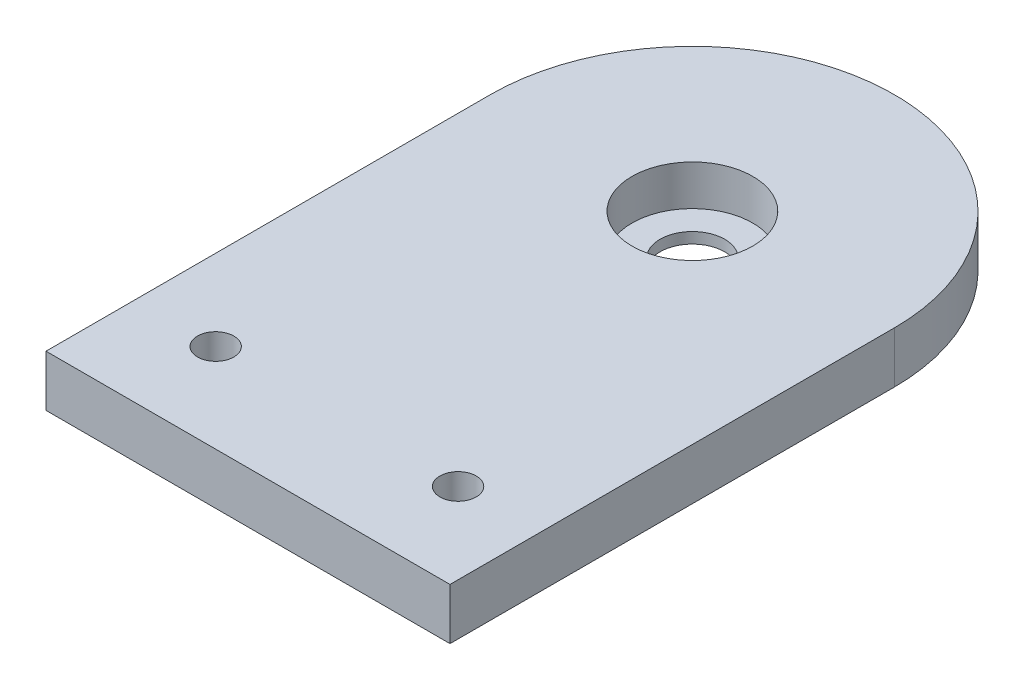
ISO-10303-21;
HEADER;
FILE_DESCRIPTION(('STEP AP214'),'2;1');
FILE_NAME('part.step','',(''),(''),'','','');
FILE_SCHEMA(('AUTOMOTIVE_DESIGN { 1 0 10303 214 1 1 1 1 }'));
ENDSEC;
DATA;
#1=APPLICATION_CONTEXT('core data for automotive mechanical design processes');
#2=APPLICATION_PROTOCOL_DEFINITION('international standard','automotive_design',2000,#1);
#3=PRODUCT_CONTEXT('',#1,'mechanical');
#4=PRODUCT('Part','Part','',(#3));
#5=PRODUCT_RELATED_PRODUCT_CATEGORY('part','',(#4));
#6=PRODUCT_DEFINITION_FORMATION('','',#4);
#7=PRODUCT_DEFINITION_CONTEXT('part definition',#1,'design');
#8=PRODUCT_DEFINITION('design','',#6,#7);
#9=PRODUCT_DEFINITION_SHAPE('','',#8);
#10=(LENGTH_UNIT() NAMED_UNIT(*) SI_UNIT(.MILLI.,.METRE.));
#11=(NAMED_UNIT(*) PLANE_ANGLE_UNIT() SI_UNIT($,.RADIAN.));
#12=(NAMED_UNIT(*) SI_UNIT($,.STERADIAN.) SOLID_ANGLE_UNIT());
#13=UNCERTAINTY_MEASURE_WITH_UNIT(LENGTH_MEASURE(1.E-05),#10,'distance_accuracy_value','');
#14=(GEOMETRIC_REPRESENTATION_CONTEXT(3) GLOBAL_UNCERTAINTY_ASSIGNED_CONTEXT((#13)) GLOBAL_UNIT_ASSIGNED_CONTEXT((#10,
#11,#12)) REPRESENTATION_CONTEXT('',''));
#15=CARTESIAN_POINT('',(0.,0.,0.));
#16=DIRECTION('',(0.,0.,1.));
#17=DIRECTION('',(1.,0.,0.));
#18=AXIS2_PLACEMENT_3D('',#15,#16,#17);
#19=CARTESIAN_POINT('',(25.,-34.5,526.));
#20=DIRECTION('',(-1.,0.,0.));
#21=DIRECTION('',(0.,0.,1.));
#22=AXIS2_PLACEMENT_3D('',#19,#20,#21);
#23=PLANE('',#22);
#24=DIRECTION('',(0.,0.,-1.));
#25=VECTOR('',#24,1.);
#26=CARTESIAN_POINT('',(25.,-40.85,526.));
#27=LINE('',#26,#25);
#28=CARTESIAN_POINT('',(25.,-40.85,545.));
#29=VERTEX_POINT('',#28);
#30=CARTESIAN_POINT('',(25.,-40.85,490.));
#31=VERTEX_POINT('',#30);
#32=EDGE_CURVE('E122',#29,#31,#27,.T.);
#33=ORIENTED_EDGE('',*,*,#32,.T.);
#34=DIRECTION('',(0.,-1.,0.));
#35=VECTOR('',#34,1.);
#36=CARTESIAN_POINT('',(25.,-34.5,490.));
#37=LINE('',#36,#35);
#38=CARTESIAN_POINT('',(25.,-34.5,490.));
#39=VERTEX_POINT('',#38);
#40=EDGE_CURVE('E11',#39,#31,#37,.T.);
#41=ORIENTED_EDGE('',*,*,#40,.F.);
#42=DIRECTION('',(0.,0.,-1.));
#43=VECTOR('',#42,1.);
#44=CARTESIAN_POINT('',(25.,-34.5,526.));
#45=LINE('',#44,#43);
#46=CARTESIAN_POINT('',(25.,-34.5,545.));
#47=VERTEX_POINT('',#46);
#48=EDGE_CURVE('E81',#47,#39,#45,.T.);
#49=ORIENTED_EDGE('',*,*,#48,.F.);
#50=DIRECTION('',(0.,-1.,0.));
#51=VECTOR('',#50,1.);
#52=CARTESIAN_POINT('',(25.,-34.5,545.));
#53=LINE('',#52,#51);
#54=EDGE_CURVE('E98',#47,#29,#53,.T.);
#55=ORIENTED_EDGE('',*,*,#54,.T.);
#56=EDGE_LOOP('',(#33,#41,#49,#55));
#57=FACE_BOUND('',#56,.T.);
#58=ADVANCED_FACE('F39',(#57),#23,.F.);
#59=CARTESIAN_POINT('',(-25.,-34.5,526.));
#60=DIRECTION('',(1.,0.,0.));
#61=DIRECTION('',(0.,0.,-1.));
#62=AXIS2_PLACEMENT_3D('',#59,#60,#61);
#63=PLANE('',#62);
#64=DIRECTION('',(0.,0.,1.));
#65=VECTOR('',#64,1.);
#66=CARTESIAN_POINT('',(-25.,-40.85,526.));
#67=LINE('',#66,#65);
#68=CARTESIAN_POINT('',(-25.,-40.85,490.));
#69=VERTEX_POINT('',#68);
#70=CARTESIAN_POINT('',(-25.,-40.85,545.));
#71=VERTEX_POINT('',#70);
#72=EDGE_CURVE('E92',#69,#71,#67,.T.);
#73=ORIENTED_EDGE('',*,*,#72,.T.);
#74=DIRECTION('',(0.,-1.,0.));
#75=VECTOR('',#74,1.);
#76=CARTESIAN_POINT('',(-25.,-34.5,545.));
#77=LINE('',#76,#75);
#78=CARTESIAN_POINT('',(-25.,-34.5,545.));
#79=VERTEX_POINT('',#78);
#80=EDGE_CURVE('E87',#79,#71,#77,.T.);
#81=ORIENTED_EDGE('',*,*,#80,.F.);
#82=DIRECTION('',(0.,0.,1.));
#83=VECTOR('',#82,1.);
#84=CARTESIAN_POINT('',(-25.,-34.5,526.));
#85=LINE('',#84,#83);
#86=CARTESIAN_POINT('',(-25.,-34.5,490.));
#87=VERTEX_POINT('',#86);
#88=EDGE_CURVE('E77',#87,#79,#85,.T.);
#89=ORIENTED_EDGE('',*,*,#88,.F.);
#90=DIRECTION('',(0.,-1.,0.));
#91=VECTOR('',#90,1.);
#92=CARTESIAN_POINT('',(-25.,-34.5,490.));
#93=LINE('',#92,#91);
#94=EDGE_CURVE('E46',#87,#69,#93,.T.);
#95=ORIENTED_EDGE('',*,*,#94,.T.);
#96=EDGE_LOOP('',(#73,#81,#89,#95));
#97=FACE_BOUND('',#96,.T.);
#98=ADVANCED_FACE('F90',(#97),#63,.F.);
#99=CARTESIAN_POINT('',(0.,-34.5,0.));
#100=DIRECTION('',(0.,-1.,0.));
#101=DIRECTION('',(0.,0.,-1.));
#102=AXIS2_PLACEMENT_3D('',#99,#100,#101);
#103=PLANE('',#102);
#104=CARTESIAN_POINT('',(-15.,-34.5,534.));
#105=DIRECTION('',(0.,1.,0.));
#106=DIRECTION('',(0.,0.,1.));
#107=AXIS2_PLACEMENT_3D('',#104,#105,#106);
#108=CIRCLE('',#107,2.25);
#109=CARTESIAN_POINT('',(-15.,-34.5,536.25));
#110=VERTEX_POINT('',#109);
#111=EDGE_CURVE('E101',#110,#110,#108,.T.);
#112=ORIENTED_EDGE('',*,*,#111,.F.);
#113=EDGE_LOOP('',(#112));
#114=FACE_BOUND('',#113,.T.);
#115=CARTESIAN_POINT('',(15.,-34.5,534.));
#116=DIRECTION('',(0.,1.,0.));
#117=DIRECTION('',(0.,0.,1.));
#118=AXIS2_PLACEMENT_3D('',#115,#116,#117);
#119=CIRCLE('',#118,2.25);
#120=CARTESIAN_POINT('',(15.,-34.5,536.25));
#121=VERTEX_POINT('',#120);
#122=EDGE_CURVE('E106',#121,#121,#119,.T.);
#123=ORIENTED_EDGE('',*,*,#122,.F.);
#124=EDGE_LOOP('',(#123));
#125=FACE_BOUND('',#124,.T.);
#126=CARTESIAN_POINT('',(0.,-34.5,490.));
#127=DIRECTION('',(0.,1.,0.));
#128=DIRECTION('',(0.,0.,1.));
#129=AXIS2_PLACEMENT_3D('',#126,#127,#128);
#130=CIRCLE('',#129,7.475);
#131=CARTESIAN_POINT('',(0.,-34.5,497.475));
#132=VERTEX_POINT('',#131);
#133=EDGE_CURVE('E114',#132,#132,#130,.T.);
#134=ORIENTED_EDGE('',*,*,#133,.F.);
#135=EDGE_LOOP('',(#134));
#136=FACE_BOUND('',#135,.T.);
#137=ORIENTED_EDGE('',*,*,#48,.T.);
#138=CARTESIAN_POINT('',(0.,-34.5,490.));
#139=DIRECTION('',(0.,1.,0.));
#140=DIRECTION('',(0.,0.,1.));
#141=AXIS2_PLACEMENT_3D('',#138,#139,#140);
#142=CIRCLE('',#141,25.);
#143=EDGE_CURVE('E82',#39,#87,#142,.T.);
#144=ORIENTED_EDGE('',*,*,#143,.T.);
#145=ORIENTED_EDGE('',*,*,#88,.T.);
#146=DIRECTION('',(1.,0.,0.));
#147=VECTOR('',#146,1.);
#148=CARTESIAN_POINT('',(-25.,-34.5,545.));
#149=LINE('',#148,#147);
#150=EDGE_CURVE('E83',#79,#47,#149,.T.);
#151=ORIENTED_EDGE('',*,*,#150,.T.);
#152=EDGE_LOOP('',(#137,#144,#145,#151));
#153=FACE_BOUND('',#152,.T.);
#154=ADVANCED_FACE('F79',(#114,#125,#136,#153),#103,.F.);
#155=CARTESIAN_POINT('',(0.,-40.85,0.));
#156=DIRECTION('',(0.,-1.,0.));
#157=DIRECTION('',(0.,0.,-1.));
#158=AXIS2_PLACEMENT_3D('',#155,#156,#157);
#159=PLANE('',#158);
#160=CARTESIAN_POINT('',(-15.,-40.85,534.));
#161=DIRECTION('',(0.,1.,0.));
#162=DIRECTION('',(0.,0.,1.));
#163=AXIS2_PLACEMENT_3D('',#160,#161,#162);
#164=CIRCLE('',#163,2.25);
#165=CARTESIAN_POINT('',(-15.,-40.85,536.25));
#166=VERTEX_POINT('',#165);
#167=EDGE_CURVE('E173',#166,#166,#164,.T.);
#168=ORIENTED_EDGE('',*,*,#167,.T.);
#169=EDGE_LOOP('',(#168));
#170=FACE_BOUND('',#169,.T.);
#171=CARTESIAN_POINT('',(15.,-40.85,534.));
#172=DIRECTION('',(0.,1.,0.));
#173=DIRECTION('',(0.,0.,1.));
#174=AXIS2_PLACEMENT_3D('',#171,#172,#173);
#175=CIRCLE('',#174,2.25);
#176=CARTESIAN_POINT('',(15.,-40.85,536.25));
#177=VERTEX_POINT('',#176);
#178=EDGE_CURVE('E172',#177,#177,#175,.T.);
#179=ORIENTED_EDGE('',*,*,#178,.T.);
#180=EDGE_LOOP('',(#179));
#181=FACE_BOUND('',#180,.T.);
#182=CARTESIAN_POINT('',(0.,-40.85,490.));
#183=DIRECTION('',(0.,1.,0.));
#184=DIRECTION('',(0.,0.,1.));
#185=AXIS2_PLACEMENT_3D('',#182,#183,#184);
#186=CIRCLE('',#185,4.);
#187=CARTESIAN_POINT('',(0.,-40.85,486.));
#188=VERTEX_POINT('',#187);
#189=EDGE_CURVE('E91',#188,#188,#186,.T.);
#190=ORIENTED_EDGE('',*,*,#189,.T.);
#191=EDGE_LOOP('',(#190));
#192=FACE_BOUND('',#191,.T.);
#193=ORIENTED_EDGE('',*,*,#72,.F.);
#194=CARTESIAN_POINT('',(0.,-40.85,490.));
#195=DIRECTION('',(0.,1.,0.));
#196=DIRECTION('',(0.,0.,1.));
#197=AXIS2_PLACEMENT_3D('',#194,#195,#196);
#198=CIRCLE('',#197,25.);
#199=EDGE_CURVE('E55',#31,#69,#198,.T.);
#200=ORIENTED_EDGE('',*,*,#199,.F.);
#201=ORIENTED_EDGE('',*,*,#32,.F.);
#202=DIRECTION('',(1.,0.,0.));
#203=VECTOR('',#202,1.);
#204=CARTESIAN_POINT('',(-25.,-40.85,545.));
#205=LINE('',#204,#203);
#206=EDGE_CURVE('E99',#71,#29,#205,.T.);
#207=ORIENTED_EDGE('',*,*,#206,.F.);
#208=EDGE_LOOP('',(#193,#200,#201,#207));
#209=FACE_BOUND('',#208,.T.);
#210=ADVANCED_FACE('F129',(#170,#181,#192,#209),#159,.T.);
#211=CARTESIAN_POINT('',(0.,-34.5,490.));
#212=DIRECTION('',(0.,-1.,0.));
#213=DIRECTION('',(0.,0.,-1.));
#214=AXIS2_PLACEMENT_3D('',#211,#212,#213);
#215=CYLINDRICAL_SURFACE('',#214,25.);
#216=ORIENTED_EDGE('',*,*,#143,.F.);
#217=ORIENTED_EDGE('',*,*,#40,.T.);
#218=ORIENTED_EDGE('',*,*,#199,.T.);
#219=ORIENTED_EDGE('',*,*,#94,.F.);
#220=EDGE_LOOP('',(#216,#217,#218,#219));
#221=FACE_BOUND('',#220,.T.);
#222=ADVANCED_FACE('F145',(#221),#215,.T.);
#223=CARTESIAN_POINT('',(0.,-34.5,490.));
#224=DIRECTION('',(0.,-1.,0.));
#225=DIRECTION('',(0.,0.,-1.));
#226=AXIS2_PLACEMENT_3D('',#223,#224,#225);
#227=CYLINDRICAL_SURFACE('',#226,7.475);
#228=ORIENTED_EDGE('',*,*,#133,.T.);
#229=EDGE_LOOP('',(#228));
#230=FACE_BOUND('',#229,.T.);
#231=CARTESIAN_POINT('',(0.,-39.5,490.));
#232=DIRECTION('',(0.,1.,0.));
#233=DIRECTION('',(0.,0.,1.));
#234=AXIS2_PLACEMENT_3D('',#231,#232,#233);
#235=CIRCLE('',#234,7.475);
#236=CARTESIAN_POINT('',(0.,-39.5,497.475));
#237=VERTEX_POINT('',#236);
#238=EDGE_CURVE('E115',#237,#237,#235,.T.);
#239=ORIENTED_EDGE('',*,*,#238,.F.);
#240=EDGE_LOOP('',(#239));
#241=FACE_BOUND('',#240,.T.);
#242=ADVANCED_FACE('F149',(#230,#241),#227,.F.);
#243=CARTESIAN_POINT('',(0.,-39.5,490.));
#244=DIRECTION('',(0.,1.,0.));
#245=DIRECTION('',(0.,0.,1.));
#246=AXIS2_PLACEMENT_3D('',#243,#244,#245);
#247=PLANE('',#246);
#248=CARTESIAN_POINT('',(0.,-39.5,490.));
#249=DIRECTION('',(0.,1.,0.));
#250=DIRECTION('',(0.,0.,1.));
#251=AXIS2_PLACEMENT_3D('',#248,#249,#250);
#252=CIRCLE('',#251,4.);
#253=CARTESIAN_POINT('',(0.,-39.5,486.));
#254=VERTEX_POINT('',#253);
#255=EDGE_CURVE('E107',#254,#254,#252,.T.);
#256=ORIENTED_EDGE('',*,*,#255,.F.);
#257=EDGE_LOOP('',(#256));
#258=FACE_BOUND('',#257,.T.);
#259=ORIENTED_EDGE('',*,*,#238,.T.);
#260=EDGE_LOOP('',(#259));
#261=FACE_BOUND('',#260,.T.);
#262=ADVANCED_FACE('F146',(#258,#261),#247,.T.);
#263=CARTESIAN_POINT('',(0.,-39.5,490.));
#264=DIRECTION('',(0.,-1.,0.));
#265=DIRECTION('',(0.,0.,-1.));
#266=AXIS2_PLACEMENT_3D('',#263,#264,#265);
#267=CYLINDRICAL_SURFACE('',#266,4.);
#268=CARTESIAN_POINT('',(0.,-39.5,486.));
#269=CARTESIAN_POINT('',(0.,-39.5140625,486.));
#270=CARTESIAN_POINT('',(0.,-39.528125,486.));
#271=CARTESIAN_POINT('',(0.,-39.55625,486.));
#272=CARTESIAN_POINT('',(0.,-39.5703125,486.));
#273=CARTESIAN_POINT('',(0.,-39.5984375,486.));
#274=CARTESIAN_POINT('',(0.,-39.6125,486.));
#275=CARTESIAN_POINT('',(0.,-39.640625,486.));
#276=CARTESIAN_POINT('',(0.,-39.6546875,486.));
#277=CARTESIAN_POINT('',(0.,-39.6828125,486.));
#278=CARTESIAN_POINT('',(0.,-39.696875,486.));
#279=CARTESIAN_POINT('',(0.,-39.725,486.));
#280=CARTESIAN_POINT('',(0.,-39.7390625,486.));
#281=CARTESIAN_POINT('',(0.,-39.7671875,486.));
#282=CARTESIAN_POINT('',(0.,-39.78125,486.));
#283=CARTESIAN_POINT('',(0.,-39.809375,486.));
#284=CARTESIAN_POINT('',(0.,-39.8234375,486.));
#285=CARTESIAN_POINT('',(0.,-39.8515625,486.));
#286=CARTESIAN_POINT('',(0.,-39.865625,486.));
#287=CARTESIAN_POINT('',(0.,-39.89375,486.));
#288=CARTESIAN_POINT('',(0.,-39.9078125,486.));
#289=CARTESIAN_POINT('',(0.,-39.9359375,486.));
#290=CARTESIAN_POINT('',(0.,-39.95,486.));
#291=CARTESIAN_POINT('',(0.,-39.978125,486.));
#292=CARTESIAN_POINT('',(0.,-39.9921875,486.));
#293=CARTESIAN_POINT('',(0.,-40.0203125,486.));
#294=CARTESIAN_POINT('',(0.,-40.034375,486.));
#295=CARTESIAN_POINT('',(0.,-40.0625,486.));
#296=CARTESIAN_POINT('',(0.,-40.0765625,486.));
#297=CARTESIAN_POINT('',(0.,-40.1046875,486.));
#298=CARTESIAN_POINT('',(0.,-40.11875,486.));
#299=CARTESIAN_POINT('',(0.,-40.146875,486.));
#300=CARTESIAN_POINT('',(0.,-40.1609375,486.));
#301=CARTESIAN_POINT('',(0.,-40.1890625,486.));
#302=CARTESIAN_POINT('',(0.,-40.203125,486.));
#303=CARTESIAN_POINT('',(0.,-40.23125,486.));
#304=CARTESIAN_POINT('',(0.,-40.2453125,486.));
#305=CARTESIAN_POINT('',(0.,-40.2734375,486.));
#306=CARTESIAN_POINT('',(0.,-40.2875,486.));
#307=CARTESIAN_POINT('',(0.,-40.315625,486.));
#308=CARTESIAN_POINT('',(0.,-40.3296875,486.));
#309=CARTESIAN_POINT('',(0.,-40.3578125,486.));
#310=CARTESIAN_POINT('',(0.,-40.371875,486.));
#311=CARTESIAN_POINT('',(0.,-40.4,486.));
#312=CARTESIAN_POINT('',(0.,-40.4140625,486.));
#313=CARTESIAN_POINT('',(0.,-40.4421875,486.));
#314=CARTESIAN_POINT('',(0.,-40.45625,486.));
#315=CARTESIAN_POINT('',(0.,-40.484375,486.));
#316=CARTESIAN_POINT('',(0.,-40.4984375,486.));
#317=CARTESIAN_POINT('',(0.,-40.5265625,486.));
#318=CARTESIAN_POINT('',(0.,-40.540625,486.));
#319=CARTESIAN_POINT('',(0.,-40.56875,486.));
#320=CARTESIAN_POINT('',(0.,-40.5828125,486.));
#321=CARTESIAN_POINT('',(0.,-40.6109375,486.));
#322=CARTESIAN_POINT('',(0.,-40.625,486.));
#323=CARTESIAN_POINT('',(0.,-40.653125,486.));
#324=CARTESIAN_POINT('',(0.,-40.6671875,486.));
#325=CARTESIAN_POINT('',(0.,-40.6953125,486.));
#326=CARTESIAN_POINT('',(0.,-40.709375,486.));
#327=CARTESIAN_POINT('',(0.,-40.7375,486.));
#328=CARTESIAN_POINT('',(0.,-40.7515625,486.));
#329=CARTESIAN_POINT('',(0.,-40.7796875,486.));
#330=CARTESIAN_POINT('',(0.,-40.79375,486.));
#331=CARTESIAN_POINT('',(0.,-40.821875,486.));
#332=CARTESIAN_POINT('',(0.,-40.8359375,486.));
#333=CARTESIAN_POINT('',(0.,-40.85,486.));
#334=B_SPLINE_CURVE_WITH_KNOTS('',3,(#268,#269,#270,#271,#272,#273,#274,#275,#276,#277,#278,
#279,#280,#281,#282,#283,#284,#285,#286,#287,#288,#289,#290,#291,#292,#293,#294,#295,#296,#297,
#298,#299,#300,#301,#302,#303,#304,#305,#306,#307,#308,#309,#310,#311,#312,#313,#314,#315,#316,
#317,#318,#319,#320,#321,#322,#323,#324,#325,#326,#327,#328,#329,#330,#331,#332,#333),
.UNSPECIFIED.,.F.,.F.,(4,2,2,2,2,2,2,2,2,2,2,2,2,2,2,2,2,2,2,2,2,2,2,2,2,2,2,2,2,2,2,2,4),(0.,
0.0421874999999988,0.0843749999999976,0.126562499999996,0.168749999999995,0.210937499999994,
0.253124999999993,0.295312499999999,0.337499999999998,0.379687499999996,0.421874999999995,
0.464062499999994,0.506249999999993,0.548437499999999,0.590624999999997,0.632812499999996,
0.674999999999995,0.717187499999994,0.759374999999993,0.801562499999992,0.843749999999997,
0.885937499999996,0.928124999999995,0.970312499999994,1.01249999999999,1.05468749999999,
1.096875,1.1390625,1.18124999999999,1.22343749999999,1.26562499999999,1.30781249999999,
1.34999999999999),.UNSPECIFIED.);
#335=EDGE_CURVE('BSEAM155',#254,#188,#334,.T.);
#336=ORIENTED_EDGE('',*,*,#255,.T.);
#337=ORIENTED_EDGE('',*,*,#189,.F.);
#338=ORIENTED_EDGE('',*,*,#335,.T.);
#339=ORIENTED_EDGE('',*,*,#335,.F.);
#340=EDGE_LOOP('',(#336,#338,#337,#339));
#341=FACE_BOUND('',#340,.T.);
#342=ADVANCED_FACE('F155',(#341),#267,.F.);
#343=CARTESIAN_POINT('',(-25.,-34.5,545.));
#344=DIRECTION('',(0.,0.,-1.));
#345=DIRECTION('',(-1.,0.,0.));
#346=AXIS2_PLACEMENT_3D('',#343,#344,#345);
#347=PLANE('',#346);
#348=ORIENTED_EDGE('',*,*,#206,.T.);
#349=ORIENTED_EDGE('',*,*,#54,.F.);
#350=ORIENTED_EDGE('',*,*,#150,.F.);
#351=ORIENTED_EDGE('',*,*,#80,.T.);
#352=EDGE_LOOP('',(#348,#349,#350,#351));
#353=FACE_BOUND('',#352,.T.);
#354=ADVANCED_FACE('F96',(#353),#347,.F.);
#355=CARTESIAN_POINT('',(15.,-34.5,534.));
#356=DIRECTION('',(0.,-1.,0.));
#357=DIRECTION('',(0.,0.,-1.));
#358=AXIS2_PLACEMENT_3D('',#355,#356,#357);
#359=CYLINDRICAL_SURFACE('',#358,2.25);
#360=ORIENTED_EDGE('',*,*,#122,.T.);
#361=EDGE_LOOP('',(#360));
#362=FACE_BOUND('',#361,.T.);
#363=ORIENTED_EDGE('',*,*,#178,.F.);
#364=EDGE_LOOP('',(#363));
#365=FACE_BOUND('',#364,.T.);
#366=ADVANCED_FACE('F159',(#362,#365),#359,.F.);
#367=CARTESIAN_POINT('',(-15.,-34.5,534.));
#368=DIRECTION('',(0.,-1.,0.));
#369=DIRECTION('',(0.,0.,-1.));
#370=AXIS2_PLACEMENT_3D('',#367,#368,#369);
#371=CYLINDRICAL_SURFACE('',#370,2.25);
#372=ORIENTED_EDGE('',*,*,#111,.T.);
#373=EDGE_LOOP('',(#372));
#374=FACE_BOUND('',#373,.T.);
#375=ORIENTED_EDGE('',*,*,#167,.F.);
#376=EDGE_LOOP('',(#375));
#377=FACE_BOUND('',#376,.T.);
#378=ADVANCED_FACE('F162',(#374,#377),#371,.F.);
#379=CLOSED_SHELL('',(#58,#98,#154,#210,#222,#242,#262,#342,#354,#366,#378));
#380=MANIFOLD_SOLID_BREP('B2',#379);
#381=ADVANCED_BREP_SHAPE_REPRESENTATION('',(#18,#380),#14);
#382=SHAPE_DEFINITION_REPRESENTATION(#9,#381);
ENDSEC;
END-ISO-10303-21;
